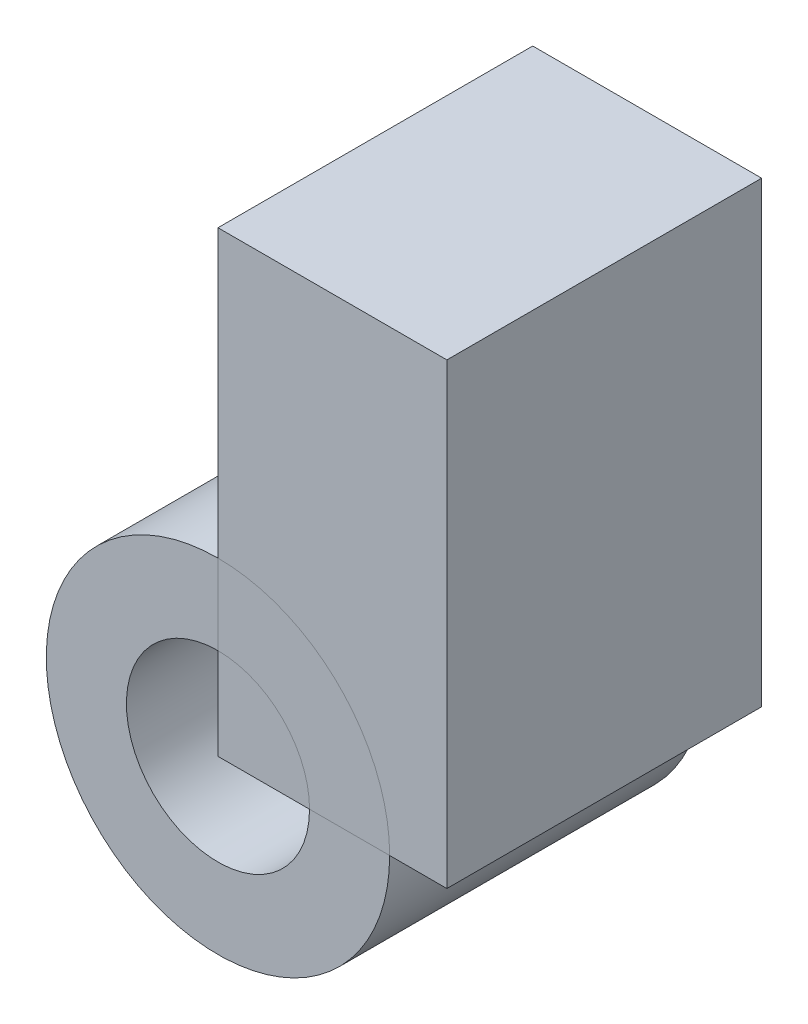
ISO-10303-21;
HEADER;
FILE_DESCRIPTION(('STEP AP214'),'2;1');
FILE_NAME('part.step','',(''),(''),'','','');
FILE_SCHEMA(('AUTOMOTIVE_DESIGN { 1 0 10303 214 1 1 1 1 }'));
ENDSEC;
DATA;
#1=APPLICATION_CONTEXT('core data for automotive mechanical design processes');
#2=APPLICATION_PROTOCOL_DEFINITION('international standard','automotive_design',2000,#1);
#3=PRODUCT_CONTEXT('',#1,'mechanical');
#4=PRODUCT('Part','Part','',(#3));
#5=PRODUCT_RELATED_PRODUCT_CATEGORY('part','',(#4));
#6=PRODUCT_DEFINITION_FORMATION('','',#4);
#7=PRODUCT_DEFINITION_CONTEXT('part definition',#1,'design');
#8=PRODUCT_DEFINITION('design','',#6,#7);
#9=PRODUCT_DEFINITION_SHAPE('','',#8);
#10=(LENGTH_UNIT() NAMED_UNIT(*) SI_UNIT(.MILLI.,.METRE.));
#11=(NAMED_UNIT(*) PLANE_ANGLE_UNIT() SI_UNIT($,.RADIAN.));
#12=(NAMED_UNIT(*) SI_UNIT($,.STERADIAN.) SOLID_ANGLE_UNIT());
#13=UNCERTAINTY_MEASURE_WITH_UNIT(LENGTH_MEASURE(1.E-05),#10,'distance_accuracy_value','');
#14=(GEOMETRIC_REPRESENTATION_CONTEXT(3) GLOBAL_UNCERTAINTY_ASSIGNED_CONTEXT((#13)) GLOBAL_UNIT_ASSIGNED_CONTEXT((#10,
#11,#12)) REPRESENTATION_CONTEXT('',''));
#15=CARTESIAN_POINT('',(0.,0.,0.));
#16=DIRECTION('',(0.,0.,1.));
#17=DIRECTION('',(1.,0.,0.));
#18=AXIS2_PLACEMENT_3D('',#15,#16,#17);
#19=CARTESIAN_POINT('',(-118.,-116.,244.));
#20=DIRECTION('',(0.,1.,0.));
#21=DIRECTION('',(1.,0.,0.));
#22=AXIS2_PLACEMENT_3D('',#19,#20,#21);
#23=PLANE('',#22);
#24=DIRECTION('',(0.,0.,1.));
#25=VECTOR('',#24,1.);
#26=CARTESIAN_POINT('',(-110.,-116.,244.));
#27=LINE('',#26,#25);
#28=CARTESIAN_POINT('',(-110.,-116.,244.));
#29=VERTEX_POINT('',#28);
#30=CARTESIAN_POINT('',(-110.,-116.,255.));
#31=VERTEX_POINT('',#30);
#32=EDGE_CURVE('E10',#29,#31,#27,.T.);
#33=ORIENTED_EDGE('',*,*,#32,.T.);
#34=DIRECTION('',(1.,0.,0.));
#35=VECTOR('',#34,1.);
#36=CARTESIAN_POINT('',(-118.,-116.,255.));
#37=LINE('',#36,#35);
#38=CARTESIAN_POINT('',(-112.,-116.,255.));
#39=VERTEX_POINT('',#38);
#40=EDGE_CURVE('E180',#39,#31,#37,.T.);
#41=ORIENTED_EDGE('',*,*,#40,.F.);
#42=DIRECTION('',(0.,0.,1.));
#43=VECTOR('',#42,1.);
#44=CARTESIAN_POINT('',(-112.,-116.,244.));
#45=LINE('',#44,#43);
#46=CARTESIAN_POINT('',(-112.,-116.,244.));
#47=VERTEX_POINT('',#46);
#48=EDGE_CURVE('E212',#47,#39,#45,.T.);
#49=ORIENTED_EDGE('',*,*,#48,.F.);
#50=DIRECTION('',(1.,0.,0.));
#51=VECTOR('',#50,1.);
#52=CARTESIAN_POINT('',(-118.,-116.,244.));
#53=LINE('',#52,#51);
#54=EDGE_CURVE('E190',#47,#29,#53,.T.);
#55=ORIENTED_EDGE('',*,*,#54,.T.);
#56=EDGE_LOOP('',(#33,#41,#49,#55));
#57=FACE_BOUND('',#56,.T.);
#58=ADVANCED_FACE('F16',(#57),#23,.F.);
#59=CARTESIAN_POINT('',(-110.,-116.,244.));
#60=DIRECTION('',(1.,0.,0.));
#61=DIRECTION('',(0.,1.,0.));
#62=AXIS2_PLACEMENT_3D('',#59,#60,#61);
#63=PLANE('',#62);
#64=ORIENTED_EDGE('',*,*,#32,.F.);
#65=DIRECTION('',(0.,1.,0.));
#66=VECTOR('',#65,1.);
#67=CARTESIAN_POINT('',(-110.,-116.,244.));
#68=LINE('',#67,#66);
#69=CARTESIAN_POINT('',(-110.,-100.,244.));
#70=VERTEX_POINT('',#69);
#71=EDGE_CURVE('E192',#29,#70,#68,.T.);
#72=ORIENTED_EDGE('',*,*,#71,.T.);
#73=DIRECTION('',(0.,0.,1.));
#74=VECTOR('',#73,1.);
#75=CARTESIAN_POINT('',(-110.,-100.,244.));
#76=LINE('',#75,#74);
#77=CARTESIAN_POINT('',(-110.,-100.,255.));
#78=VERTEX_POINT('',#77);
#79=EDGE_CURVE('E20',#70,#78,#76,.T.);
#80=ORIENTED_EDGE('',*,*,#79,.T.);
#81=DIRECTION('',(0.,1.,0.));
#82=VECTOR('',#81,1.);
#83=CARTESIAN_POINT('',(-110.,-116.,255.));
#84=LINE('',#83,#82);
#85=EDGE_CURVE('E175',#31,#78,#84,.T.);
#86=ORIENTED_EDGE('',*,*,#85,.F.);
#87=EDGE_LOOP('',(#64,#72,#80,#86));
#88=FACE_BOUND('',#87,.T.);
#89=ADVANCED_FACE('F261',(#88),#63,.T.);
#90=CARTESIAN_POINT('',(-118.,-100.,244.));
#91=DIRECTION('',(0.,1.,0.));
#92=DIRECTION('',(1.,0.,0.));
#93=AXIS2_PLACEMENT_3D('',#90,#91,#92);
#94=PLANE('',#93);
#95=DIRECTION('',(1.,0.,0.));
#96=VECTOR('',#95,1.);
#97=CARTESIAN_POINT('',(-118.,-100.,244.));
#98=LINE('',#97,#96);
#99=CARTESIAN_POINT('',(-118.,-100.,244.));
#100=VERTEX_POINT('',#99);
#101=EDGE_CURVE('E213',#100,#70,#98,.T.);
#102=ORIENTED_EDGE('',*,*,#101,.F.);
#103=DIRECTION('',(0.,0.,1.));
#104=VECTOR('',#103,1.);
#105=CARTESIAN_POINT('',(-118.,-100.,244.));
#106=LINE('',#105,#104);
#107=CARTESIAN_POINT('',(-118.,-100.,255.));
#108=VERTEX_POINT('',#107);
#109=EDGE_CURVE('E204',#100,#108,#106,.T.);
#110=ORIENTED_EDGE('',*,*,#109,.T.);
#111=DIRECTION('',(1.,0.,0.));
#112=VECTOR('',#111,1.);
#113=CARTESIAN_POINT('',(-118.,-100.,255.));
#114=LINE('',#113,#112);
#115=EDGE_CURVE('E179',#108,#78,#114,.T.);
#116=ORIENTED_EDGE('',*,*,#115,.T.);
#117=ORIENTED_EDGE('',*,*,#79,.F.);
#118=EDGE_LOOP('',(#102,#110,#116,#117));
#119=FACE_BOUND('',#118,.T.);
#120=ADVANCED_FACE('F260',(#119),#94,.T.);
#121=CARTESIAN_POINT('',(-118.,-116.,244.));
#122=DIRECTION('',(1.,0.,0.));
#123=DIRECTION('',(0.,1.,0.));
#124=AXIS2_PLACEMENT_3D('',#121,#122,#123);
#125=PLANE('',#124);
#126=ORIENTED_EDGE('',*,*,#109,.F.);
#127=DIRECTION('',(0.,1.,0.));
#128=VECTOR('',#127,1.);
#129=CARTESIAN_POINT('',(-118.,-116.,244.));
#130=LINE('',#129,#128);
#131=CARTESIAN_POINT('',(-118.,-110.,244.));
#132=VERTEX_POINT('',#131);
#133=EDGE_CURVE('E106',#132,#100,#130,.T.);
#134=ORIENTED_EDGE('',*,*,#133,.F.);
#135=DIRECTION('',(0.,0.,1.));
#136=VECTOR('',#135,1.);
#137=CARTESIAN_POINT('',(-118.,-110.,244.));
#138=LINE('',#137,#136);
#139=CARTESIAN_POINT('',(-118.,-110.,255.));
#140=VERTEX_POINT('',#139);
#141=EDGE_CURVE('E112',#132,#140,#138,.T.);
#142=ORIENTED_EDGE('',*,*,#141,.T.);
#143=DIRECTION('',(0.,1.,0.));
#144=VECTOR('',#143,1.);
#145=CARTESIAN_POINT('',(-118.,-116.,255.));
#146=LINE('',#145,#144);
#147=EDGE_CURVE('E173',#140,#108,#146,.T.);
#148=ORIENTED_EDGE('',*,*,#147,.T.);
#149=EDGE_LOOP('',(#126,#134,#142,#148));
#150=FACE_BOUND('',#149,.T.);
#151=ADVANCED_FACE('F254',(#150),#125,.F.);
#152=CARTESIAN_POINT('',(-118.,-116.,244.));
#153=DIRECTION('',(0.,0.,1.));
#154=DIRECTION('',(1.,0.,0.));
#155=AXIS2_PLACEMENT_3D('',#152,#153,#154);
#156=PLANE('',#155);
#157=ORIENTED_EDGE('',*,*,#101,.T.);
#158=ORIENTED_EDGE('',*,*,#71,.F.);
#159=ORIENTED_EDGE('',*,*,#54,.F.);
#160=CARTESIAN_POINT('',(-118.,-116.,244.));
#161=DIRECTION('',(0.,0.,1.));
#162=DIRECTION('',(1.,0.,0.));
#163=AXIS2_PLACEMENT_3D('',#160,#161,#162);
#164=CIRCLE('',#163,6.);
#165=EDGE_CURVE('E169',#47,#132,#164,.T.);
#166=ORIENTED_EDGE('',*,*,#165,.T.);
#167=ORIENTED_EDGE('',*,*,#133,.T.);
#168=EDGE_LOOP('',(#157,#158,#159,#166,#167));
#169=FACE_BOUND('',#168,.T.);
#170=ADVANCED_FACE('F258',(#169),#156,.F.);
#171=CARTESIAN_POINT('',(-118.,-116.,244.));
#172=DIRECTION('',(0.,0.,1.));
#173=DIRECTION('',(1.,0.,0.));
#174=AXIS2_PLACEMENT_3D('',#171,#172,#173);
#175=CYLINDRICAL_SURFACE('',#174,6.);
#176=ORIENTED_EDGE('',*,*,#48,.T.);
#177=CARTESIAN_POINT('',(-118.,-116.,255.));
#178=DIRECTION('',(0.,0.,1.));
#179=DIRECTION('',(1.,0.,0.));
#180=AXIS2_PLACEMENT_3D('',#177,#178,#179);
#181=CIRCLE('',#180,6.);
#182=EDGE_CURVE('E174',#140,#39,#181,.T.);
#183=ORIENTED_EDGE('',*,*,#182,.F.);
#184=ORIENTED_EDGE('',*,*,#141,.F.);
#185=CARTESIAN_POINT('',(-118.,-116.,244.));
#186=DIRECTION('',(0.,0.,1.));
#187=DIRECTION('',(1.,0.,0.));
#188=AXIS2_PLACEMENT_3D('',#185,#186,#187);
#189=CIRCLE('',#188,6.);
#190=EDGE_CURVE('E126',#132,#47,#189,.T.);
#191=ORIENTED_EDGE('',*,*,#190,.T.);
#192=EDGE_LOOP('',(#176,#183,#184,#191));
#193=FACE_BOUND('',#192,.T.);
#194=ADVANCED_FACE('F264',(#193),#175,.T.);
#195=CARTESIAN_POINT('',(-118.,-116.,255.));
#196=DIRECTION('',(0.,0.,1.));
#197=DIRECTION('',(1.,0.,0.));
#198=AXIS2_PLACEMENT_3D('',#195,#196,#197);
#199=PLANE('',#198);
#200=ORIENTED_EDGE('',*,*,#147,.F.);
#201=CARTESIAN_POINT('',(-118.,-116.,255.));
#202=DIRECTION('',(0.,0.,1.));
#203=DIRECTION('',(1.,0.,0.));
#204=AXIS2_PLACEMENT_3D('',#201,#202,#203);
#205=CIRCLE('',#204,6.);
#206=EDGE_CURVE('E194',#39,#140,#205,.T.);
#207=ORIENTED_EDGE('',*,*,#206,.F.);
#208=ORIENTED_EDGE('',*,*,#40,.T.);
#209=ORIENTED_EDGE('',*,*,#85,.T.);
#210=ORIENTED_EDGE('',*,*,#115,.F.);
#211=EDGE_LOOP('',(#200,#207,#208,#209,#210));
#212=FACE_BOUND('',#211,.T.);
#213=ADVANCED_FACE('F251',(#212),#199,.T.);
#214=CARTESIAN_POINT('',(-118.,-116.,244.));
#215=DIRECTION('',(0.,0.,1.));
#216=DIRECTION('',(1.,0.,0.));
#217=AXIS2_PLACEMENT_3D('',#214,#215,#216);
#218=PLANE('',#217);
#219=CARTESIAN_POINT('',(-118.,-116.,244.));
#220=DIRECTION('',(0.,0.,1.));
#221=DIRECTION('',(1.,0.,0.));
#222=AXIS2_PLACEMENT_3D('',#219,#220,#221);
#223=CIRCLE('',#222,3.2);
#224=CARTESIAN_POINT('',(-114.8,-116.,244.));
#225=VERTEX_POINT('',#224);
#226=CARTESIAN_POINT('',(-118.,-112.8,244.));
#227=VERTEX_POINT('',#226);
#228=EDGE_CURVE('E131',#225,#227,#223,.T.);
#229=ORIENTED_EDGE('',*,*,#228,.T.);
#230=DIRECTION('',(0.,1.,0.));
#231=VECTOR('',#230,1.);
#232=CARTESIAN_POINT('',(-118.,-116.,244.));
#233=LINE('',#232,#231);
#234=EDGE_CURVE('E122',#227,#132,#233,.T.);
#235=ORIENTED_EDGE('',*,*,#234,.T.);
#236=ORIENTED_EDGE('',*,*,#165,.F.);
#237=DIRECTION('',(1.,0.,0.));
#238=VECTOR('',#237,1.);
#239=CARTESIAN_POINT('',(-118.,-116.,244.));
#240=LINE('',#239,#238);
#241=EDGE_CURVE('E72',#225,#47,#240,.T.);
#242=ORIENTED_EDGE('',*,*,#241,.F.);
#243=EDGE_LOOP('',(#229,#235,#236,#242));
#244=FACE_BOUND('',#243,.T.);
#245=ADVANCED_FACE('F132',(#244),#218,.F.);
#246=CARTESIAN_POINT('',(-118.,-116.,255.));
#247=DIRECTION('',(0.,0.,1.));
#248=DIRECTION('',(1.,0.,0.));
#249=AXIS2_PLACEMENT_3D('',#246,#247,#248);
#250=PLANE('',#249);
#251=ORIENTED_EDGE('',*,*,#182,.T.);
#252=DIRECTION('',(1.,0.,0.));
#253=VECTOR('',#252,1.);
#254=CARTESIAN_POINT('',(-118.,-116.,255.));
#255=LINE('',#254,#253);
#256=CARTESIAN_POINT('',(-114.8,-116.,255.));
#257=VERTEX_POINT('',#256);
#258=EDGE_CURVE('E87',#257,#39,#255,.T.);
#259=ORIENTED_EDGE('',*,*,#258,.F.);
#260=CARTESIAN_POINT('',(-118.,-116.,255.));
#261=DIRECTION('',(0.,0.,1.));
#262=DIRECTION('',(1.,0.,0.));
#263=AXIS2_PLACEMENT_3D('',#260,#261,#262);
#264=CIRCLE('',#263,3.2);
#265=CARTESIAN_POINT('',(-118.,-112.8,255.));
#266=VERTEX_POINT('',#265);
#267=EDGE_CURVE('E147',#266,#257,#264,.T.);
#268=ORIENTED_EDGE('',*,*,#267,.F.);
#269=DIRECTION('',(0.,1.,0.));
#270=VECTOR('',#269,1.);
#271=CARTESIAN_POINT('',(-118.,-116.,255.));
#272=LINE('',#271,#270);
#273=EDGE_CURVE('E128',#266,#140,#272,.T.);
#274=ORIENTED_EDGE('',*,*,#273,.T.);
#275=EDGE_LOOP('',(#251,#259,#268,#274));
#276=FACE_BOUND('',#275,.T.);
#277=ADVANCED_FACE('F247',(#276),#250,.T.);
#278=CARTESIAN_POINT('',(-118.,-116.,244.));
#279=DIRECTION('',(0.,0.,1.));
#280=DIRECTION('',(1.,0.,0.));
#281=AXIS2_PLACEMENT_3D('',#278,#279,#280);
#282=PLANE('',#281);
#283=ORIENTED_EDGE('',*,*,#234,.F.);
#284=CARTESIAN_POINT('',(-118.,-116.,244.));
#285=DIRECTION('',(0.,0.,1.));
#286=DIRECTION('',(1.,0.,0.));
#287=AXIS2_PLACEMENT_3D('',#284,#285,#286);
#288=CIRCLE('',#287,3.2);
#289=EDGE_CURVE('E124',#227,#225,#288,.T.);
#290=ORIENTED_EDGE('',*,*,#289,.T.);
#291=ORIENTED_EDGE('',*,*,#241,.T.);
#292=ORIENTED_EDGE('',*,*,#190,.F.);
#293=EDGE_LOOP('',(#283,#290,#291,#292));
#294=FACE_BOUND('',#293,.T.);
#295=ADVANCED_FACE('F18',(#294),#282,.F.);
#296=CARTESIAN_POINT('',(-118.,-116.,255.));
#297=DIRECTION('',(0.,0.,1.));
#298=DIRECTION('',(1.,0.,0.));
#299=AXIS2_PLACEMENT_3D('',#296,#297,#298);
#300=PLANE('',#299);
#301=ORIENTED_EDGE('',*,*,#258,.T.);
#302=ORIENTED_EDGE('',*,*,#206,.T.);
#303=ORIENTED_EDGE('',*,*,#273,.F.);
#304=CARTESIAN_POINT('',(-118.,-116.,255.));
#305=DIRECTION('',(0.,0.,1.));
#306=DIRECTION('',(1.,0.,0.));
#307=AXIS2_PLACEMENT_3D('',#304,#305,#306);
#308=CIRCLE('',#307,3.2);
#309=EDGE_CURVE('E148',#257,#266,#308,.T.);
#310=ORIENTED_EDGE('',*,*,#309,.F.);
#311=EDGE_LOOP('',(#301,#302,#303,#310));
#312=FACE_BOUND('',#311,.T.);
#313=ADVANCED_FACE('F245',(#312),#300,.T.);
#314=CARTESIAN_POINT('',(-118.,-116.,244.));
#315=DIRECTION('',(0.,1.,0.));
#316=DIRECTION('',(1.,0.,0.));
#317=AXIS2_PLACEMENT_3D('',#314,#315,#316);
#318=PLANE('',#317);
#319=DIRECTION('',(0.,0.,1.));
#320=VECTOR('',#319,1.);
#321=CARTESIAN_POINT('',(-114.8,-116.,244.));
#322=LINE('',#321,#320);
#323=EDGE_CURVE('E138',#225,#257,#322,.T.);
#324=ORIENTED_EDGE('',*,*,#323,.T.);
#325=DIRECTION('',(1.,0.,0.));
#326=VECTOR('',#325,1.);
#327=CARTESIAN_POINT('',(-118.,-116.,255.));
#328=LINE('',#327,#326);
#329=CARTESIAN_POINT('',(-118.,-116.,255.));
#330=VERTEX_POINT('',#329);
#331=EDGE_CURVE('E201',#330,#257,#328,.T.);
#332=ORIENTED_EDGE('',*,*,#331,.F.);
#333=DIRECTION('',(0.,0.,1.));
#334=VECTOR('',#333,1.);
#335=CARTESIAN_POINT('',(-118.,-116.,244.));
#336=LINE('',#335,#334);
#337=CARTESIAN_POINT('',(-118.,-116.,244.));
#338=VERTEX_POINT('',#337);
#339=EDGE_CURVE('E157',#338,#330,#336,.T.);
#340=ORIENTED_EDGE('',*,*,#339,.F.);
#341=DIRECTION('',(1.,0.,0.));
#342=VECTOR('',#341,1.);
#343=CARTESIAN_POINT('',(-118.,-116.,244.));
#344=LINE('',#343,#342);
#345=EDGE_CURVE('E137',#338,#225,#344,.T.);
#346=ORIENTED_EDGE('',*,*,#345,.T.);
#347=EDGE_LOOP('',(#324,#332,#340,#346));
#348=FACE_BOUND('',#347,.T.);
#349=ADVANCED_FACE('F243',(#348),#318,.F.);
#350=CARTESIAN_POINT('',(-118.,-116.,244.));
#351=DIRECTION('',(0.,0.,1.));
#352=DIRECTION('',(1.,0.,0.));
#353=AXIS2_PLACEMENT_3D('',#350,#351,#352);
#354=PLANE('',#353);
#355=ORIENTED_EDGE('',*,*,#228,.F.);
#356=ORIENTED_EDGE('',*,*,#345,.F.);
#357=DIRECTION('',(0.,1.,0.));
#358=VECTOR('',#357,1.);
#359=CARTESIAN_POINT('',(-118.,-116.,244.));
#360=LINE('',#359,#358);
#361=EDGE_CURVE('E151',#338,#227,#360,.T.);
#362=ORIENTED_EDGE('',*,*,#361,.T.);
#363=EDGE_LOOP('',(#355,#356,#362));
#364=FACE_BOUND('',#363,.T.);
#365=ADVANCED_FACE('F152',(#364),#354,.F.);
#366=CARTESIAN_POINT('',(-118.,-116.,244.));
#367=DIRECTION('',(0.,0.,1.));
#368=DIRECTION('',(1.,0.,0.));
#369=AXIS2_PLACEMENT_3D('',#366,#367,#368);
#370=CYLINDRICAL_SURFACE('',#369,3.2);
#371=ORIENTED_EDGE('',*,*,#289,.F.);
#372=DIRECTION('',(0.,0.,1.));
#373=VECTOR('',#372,1.);
#374=CARTESIAN_POINT('',(-118.,-112.8,244.));
#375=LINE('',#374,#373);
#376=EDGE_CURVE('E145',#227,#266,#375,.T.);
#377=ORIENTED_EDGE('',*,*,#376,.T.);
#378=ORIENTED_EDGE('',*,*,#267,.T.);
#379=ORIENTED_EDGE('',*,*,#323,.F.);
#380=EDGE_LOOP('',(#371,#377,#378,#379));
#381=FACE_BOUND('',#380,.T.);
#382=ADVANCED_FACE('F142',(#381),#370,.F.);
#383=CARTESIAN_POINT('',(-118.,-116.,255.));
#384=DIRECTION('',(0.,0.,1.));
#385=DIRECTION('',(1.,0.,0.));
#386=AXIS2_PLACEMENT_3D('',#383,#384,#385);
#387=PLANE('',#386);
#388=DIRECTION('',(0.,1.,0.));
#389=VECTOR('',#388,1.);
#390=CARTESIAN_POINT('',(-118.,-116.,255.));
#391=LINE('',#390,#389);
#392=EDGE_CURVE('E162',#330,#266,#391,.T.);
#393=ORIENTED_EDGE('',*,*,#392,.F.);
#394=ORIENTED_EDGE('',*,*,#331,.T.);
#395=ORIENTED_EDGE('',*,*,#309,.T.);
#396=EDGE_LOOP('',(#393,#394,#395));
#397=FACE_BOUND('',#396,.T.);
#398=ADVANCED_FACE('F240',(#397),#387,.T.);
#399=CARTESIAN_POINT('',(-118.,-116.,244.));
#400=DIRECTION('',(1.,0.,0.));
#401=DIRECTION('',(0.,1.,0.));
#402=AXIS2_PLACEMENT_3D('',#399,#400,#401);
#403=PLANE('',#402);
#404=ORIENTED_EDGE('',*,*,#376,.F.);
#405=ORIENTED_EDGE('',*,*,#361,.F.);
#406=ORIENTED_EDGE('',*,*,#339,.T.);
#407=ORIENTED_EDGE('',*,*,#392,.T.);
#408=EDGE_LOOP('',(#404,#405,#406,#407));
#409=FACE_BOUND('',#408,.T.);
#410=ADVANCED_FACE('F160',(#409),#403,.F.);
#411=CLOSED_SHELL('',(#58,#89,#120,#151,#170,#194,#213,#245,#277,#295,#313,#349,#365,#382,#398,#410));
#412=MANIFOLD_SOLID_BREP('B1',#411);
#413=ADVANCED_BREP_SHAPE_REPRESENTATION('',(#18,#412),#14);
#414=SHAPE_DEFINITION_REPRESENTATION(#9,#413);
ENDSEC;
END-ISO-10303-21;
